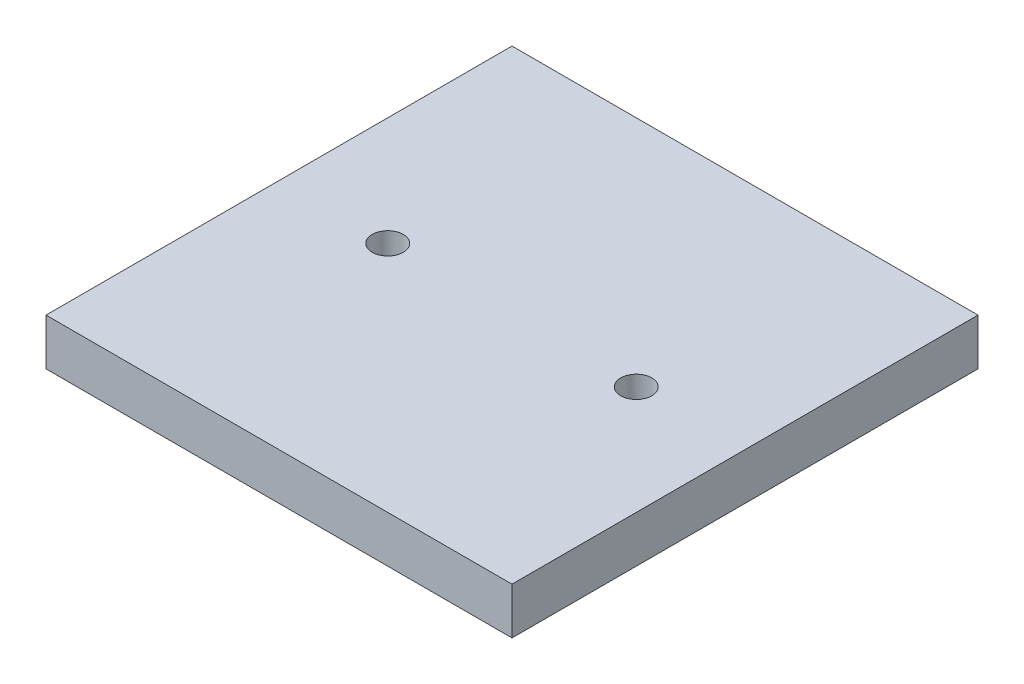
ISO-10303-21;
HEADER;
FILE_DESCRIPTION(('STEP AP214'),'2;1');
FILE_NAME('part.step','',(''),(''),'','','');
FILE_SCHEMA(('AUTOMOTIVE_DESIGN { 1 0 10303 214 1 1 1 1 }'));
ENDSEC;
DATA;
#1=APPLICATION_CONTEXT('core data for automotive mechanical design processes');
#2=APPLICATION_PROTOCOL_DEFINITION('international standard','automotive_design',2000,#1);
#3=PRODUCT_CONTEXT('',#1,'mechanical');
#4=PRODUCT('Part','Part','',(#3));
#5=PRODUCT_RELATED_PRODUCT_CATEGORY('part','',(#4));
#6=PRODUCT_DEFINITION_FORMATION('','',#4);
#7=PRODUCT_DEFINITION_CONTEXT('part definition',#1,'design');
#8=PRODUCT_DEFINITION('design','',#6,#7);
#9=PRODUCT_DEFINITION_SHAPE('','',#8);
#10=(LENGTH_UNIT() NAMED_UNIT(*) SI_UNIT(.MILLI.,.METRE.));
#11=(NAMED_UNIT(*) PLANE_ANGLE_UNIT() SI_UNIT($,.RADIAN.));
#12=(NAMED_UNIT(*) SI_UNIT($,.STERADIAN.) SOLID_ANGLE_UNIT());
#13=UNCERTAINTY_MEASURE_WITH_UNIT(LENGTH_MEASURE(1.E-05),#10,'distance_accuracy_value','');
#14=(GEOMETRIC_REPRESENTATION_CONTEXT(3) GLOBAL_UNCERTAINTY_ASSIGNED_CONTEXT((#13)) GLOBAL_UNIT_ASSIGNED_CONTEXT((#10,
#11,#12)) REPRESENTATION_CONTEXT('',''));
#15=CARTESIAN_POINT('',(0.,0.,0.));
#16=DIRECTION('',(0.,0.,1.));
#17=DIRECTION('',(1.,0.,0.));
#18=AXIS2_PLACEMENT_3D('',#15,#16,#17);
#19=CARTESIAN_POINT('',(15.,3.,-15.));
#20=DIRECTION('',(-1.,0.,0.));
#21=DIRECTION('',(0.,0.,1.));
#22=AXIS2_PLACEMENT_3D('',#19,#20,#21);
#23=PLANE('',#22);
#24=DIRECTION('',(0.,0.,-1.));
#25=VECTOR('',#24,1.);
#26=CARTESIAN_POINT('',(15.,0.,-15.));
#27=LINE('',#26,#25);
#28=CARTESIAN_POINT('',(15.,0.,15.));
#29=VERTEX_POINT('',#28);
#30=CARTESIAN_POINT('',(15.,0.,-15.));
#31=VERTEX_POINT('',#30);
#32=EDGE_CURVE('E100',#29,#31,#27,.T.);
#33=ORIENTED_EDGE('',*,*,#32,.T.);
#34=DIRECTION('',(0.,-1.,0.));
#35=VECTOR('',#34,1.);
#36=CARTESIAN_POINT('',(15.,3.,-15.));
#37=LINE('',#36,#35);
#38=CARTESIAN_POINT('',(15.,3.,-15.));
#39=VERTEX_POINT('',#38);
#40=EDGE_CURVE('E11',#39,#31,#37,.T.);
#41=ORIENTED_EDGE('',*,*,#40,.F.);
#42=DIRECTION('',(0.,0.,-1.));
#43=VECTOR('',#42,1.);
#44=CARTESIAN_POINT('',(15.,3.,-15.));
#45=LINE('',#44,#43);
#46=CARTESIAN_POINT('',(15.,3.,15.));
#47=VERTEX_POINT('',#46);
#48=EDGE_CURVE('E88',#47,#39,#45,.T.);
#49=ORIENTED_EDGE('',*,*,#48,.F.);
#50=DIRECTION('',(0.,-1.,0.));
#51=VECTOR('',#50,1.);
#52=CARTESIAN_POINT('',(15.,3.,15.));
#53=LINE('',#52,#51);
#54=EDGE_CURVE('E96',#47,#29,#53,.T.);
#55=ORIENTED_EDGE('',*,*,#54,.T.);
#56=EDGE_LOOP('',(#33,#41,#49,#55));
#57=FACE_BOUND('',#56,.T.);
#58=ADVANCED_FACE('F37',(#57),#23,.F.);
#59=CARTESIAN_POINT('',(-15.,3.,-15.));
#60=DIRECTION('',(0.,0.,1.));
#61=DIRECTION('',(1.,0.,0.));
#62=AXIS2_PLACEMENT_3D('',#59,#60,#61);
#63=PLANE('',#62);
#64=DIRECTION('',(-1.,0.,0.));
#65=VECTOR('',#64,1.);
#66=CARTESIAN_POINT('',(-15.,0.,-15.));
#67=LINE('',#66,#65);
#68=CARTESIAN_POINT('',(-15.,0.,-15.));
#69=VERTEX_POINT('',#68);
#70=EDGE_CURVE('E92',#31,#69,#67,.T.);
#71=ORIENTED_EDGE('',*,*,#70,.T.);
#72=DIRECTION('',(0.,-1.,0.));
#73=VECTOR('',#72,1.);
#74=CARTESIAN_POINT('',(-15.,3.,-15.));
#75=LINE('',#74,#73);
#76=CARTESIAN_POINT('',(-15.,3.,-15.));
#77=VERTEX_POINT('',#76);
#78=EDGE_CURVE('E45',#77,#69,#75,.T.);
#79=ORIENTED_EDGE('',*,*,#78,.F.);
#80=DIRECTION('',(-1.,0.,0.));
#81=VECTOR('',#80,1.);
#82=CARTESIAN_POINT('',(-15.,3.,-15.));
#83=LINE('',#82,#81);
#84=EDGE_CURVE('E83',#39,#77,#83,.T.);
#85=ORIENTED_EDGE('',*,*,#84,.F.);
#86=ORIENTED_EDGE('',*,*,#40,.T.);
#87=EDGE_LOOP('',(#71,#79,#85,#86));
#88=FACE_BOUND('',#87,.T.);
#89=ADVANCED_FACE('F91',(#88),#63,.F.);
#90=CARTESIAN_POINT('',(-15.,3.,-15.));
#91=DIRECTION('',(1.,0.,0.));
#92=DIRECTION('',(0.,0.,-1.));
#93=AXIS2_PLACEMENT_3D('',#90,#91,#92);
#94=PLANE('',#93);
#95=DIRECTION('',(0.,0.,1.));
#96=VECTOR('',#95,1.);
#97=CARTESIAN_POINT('',(-15.,0.,-15.));
#98=LINE('',#97,#96);
#99=CARTESIAN_POINT('',(-15.,0.,15.));
#100=VERTEX_POINT('',#99);
#101=EDGE_CURVE('E70',#69,#100,#98,.T.);
#102=ORIENTED_EDGE('',*,*,#101,.T.);
#103=DIRECTION('',(0.,-1.,0.));
#104=VECTOR('',#103,1.);
#105=CARTESIAN_POINT('',(-15.,3.,15.));
#106=LINE('',#105,#104);
#107=CARTESIAN_POINT('',(-15.,3.,15.));
#108=VERTEX_POINT('',#107);
#109=EDGE_CURVE('E93',#108,#100,#106,.T.);
#110=ORIENTED_EDGE('',*,*,#109,.F.);
#111=DIRECTION('',(0.,0.,1.));
#112=VECTOR('',#111,1.);
#113=CARTESIAN_POINT('',(-15.,3.,-15.));
#114=LINE('',#113,#112);
#115=EDGE_CURVE('E86',#77,#108,#114,.T.);
#116=ORIENTED_EDGE('',*,*,#115,.F.);
#117=ORIENTED_EDGE('',*,*,#78,.T.);
#118=EDGE_LOOP('',(#102,#110,#116,#117));
#119=FACE_BOUND('',#118,.T.);
#120=ADVANCED_FACE('F94',(#119),#94,.F.);
#121=CARTESIAN_POINT('',(-15.,3.,15.));
#122=DIRECTION('',(0.,0.,-1.));
#123=DIRECTION('',(-1.,0.,0.));
#124=AXIS2_PLACEMENT_3D('',#121,#122,#123);
#125=PLANE('',#124);
#126=DIRECTION('',(1.,0.,0.));
#127=VECTOR('',#126,1.);
#128=CARTESIAN_POINT('',(-15.,0.,15.));
#129=LINE('',#128,#127);
#130=EDGE_CURVE('E76',#100,#29,#129,.T.);
#131=ORIENTED_EDGE('',*,*,#130,.T.);
#132=ORIENTED_EDGE('',*,*,#54,.F.);
#133=DIRECTION('',(1.,0.,0.));
#134=VECTOR('',#133,1.);
#135=CARTESIAN_POINT('',(-15.,3.,15.));
#136=LINE('',#135,#134);
#137=EDGE_CURVE('E53',#108,#47,#136,.T.);
#138=ORIENTED_EDGE('',*,*,#137,.F.);
#139=ORIENTED_EDGE('',*,*,#109,.T.);
#140=EDGE_LOOP('',(#131,#132,#138,#139));
#141=FACE_BOUND('',#140,.T.);
#142=ADVANCED_FACE('F108',(#141),#125,.F.);
#143=CARTESIAN_POINT('',(0.,3.,0.));
#144=DIRECTION('',(0.,1.,0.));
#145=DIRECTION('',(0.,0.,1.));
#146=AXIS2_PLACEMENT_3D('',#143,#144,#145);
#147=PLANE('',#146);
#148=CARTESIAN_POINT('',(-7.99999999999999,3.,0.));
#149=DIRECTION('',(0.,1.,0.));
#150=DIRECTION('',(0.,0.,1.));
#151=AXIS2_PLACEMENT_3D('',#148,#149,#150);
#152=CIRCLE('',#151,0.999999999999998);
#153=CARTESIAN_POINT('',(-7.99999999999999,3.,0.999999999999998));
#154=VERTEX_POINT('',#153);
#155=EDGE_CURVE('E120',#154,#154,#152,.T.);
#156=ORIENTED_EDGE('',*,*,#155,.F.);
#157=EDGE_LOOP('',(#156));
#158=FACE_BOUND('',#157,.T.);
#159=CARTESIAN_POINT('',(7.99999999999999,3.,0.));
#160=DIRECTION('',(0.,1.,0.));
#161=DIRECTION('',(0.,0.,1.));
#162=AXIS2_PLACEMENT_3D('',#159,#160,#161);
#163=CIRCLE('',#162,0.999999999999998);
#164=CARTESIAN_POINT('',(7.99999999999999,3.,0.999999999999995));
#165=VERTEX_POINT('',#164);
#166=EDGE_CURVE('E117',#165,#165,#163,.T.);
#167=ORIENTED_EDGE('',*,*,#166,.F.);
#168=EDGE_LOOP('',(#167));
#169=FACE_BOUND('',#168,.T.);
#170=ORIENTED_EDGE('',*,*,#48,.T.);
#171=ORIENTED_EDGE('',*,*,#84,.T.);
#172=ORIENTED_EDGE('',*,*,#115,.T.);
#173=ORIENTED_EDGE('',*,*,#137,.T.);
#174=EDGE_LOOP('',(#170,#171,#172,#173));
#175=FACE_BOUND('',#174,.T.);
#176=ADVANCED_FACE('F84',(#158,#169,#175),#147,.T.);
#177=CARTESIAN_POINT('',(0.,0.,0.));
#178=DIRECTION('',(0.,1.,0.));
#179=DIRECTION('',(0.,0.,1.));
#180=AXIS2_PLACEMENT_3D('',#177,#178,#179);
#181=PLANE('',#180);
#182=CARTESIAN_POINT('',(-7.99999999999999,0.,0.));
#183=DIRECTION('',(0.,1.,0.));
#184=DIRECTION('',(0.,0.,1.));
#185=AXIS2_PLACEMENT_3D('',#182,#183,#184);
#186=CIRCLE('',#185,0.999999999999998);
#187=CARTESIAN_POINT('',(-7.99999999999999,0.,0.999999999999998));
#188=VERTEX_POINT('',#187);
#189=EDGE_CURVE('E103',#188,#188,#186,.T.);
#190=ORIENTED_EDGE('',*,*,#189,.T.);
#191=EDGE_LOOP('',(#190));
#192=FACE_BOUND('',#191,.T.);
#193=CARTESIAN_POINT('',(7.99999999999999,0.,0.));
#194=DIRECTION('',(0.,1.,0.));
#195=DIRECTION('',(0.,0.,1.));
#196=AXIS2_PLACEMENT_3D('',#193,#194,#195);
#197=CIRCLE('',#196,0.999999999999998);
#198=CARTESIAN_POINT('',(7.99999999999999,0.,0.999999999999995));
#199=VERTEX_POINT('',#198);
#200=EDGE_CURVE('E114',#199,#199,#197,.T.);
#201=ORIENTED_EDGE('',*,*,#200,.T.);
#202=EDGE_LOOP('',(#201));
#203=FACE_BOUND('',#202,.T.);
#204=ORIENTED_EDGE('',*,*,#32,.F.);
#205=ORIENTED_EDGE('',*,*,#130,.F.);
#206=ORIENTED_EDGE('',*,*,#101,.F.);
#207=ORIENTED_EDGE('',*,*,#70,.F.);
#208=EDGE_LOOP('',(#204,#205,#206,#207));
#209=FACE_BOUND('',#208,.T.);
#210=ADVANCED_FACE('F111',(#192,#203,#209),#181,.F.);
#211=CARTESIAN_POINT('',(7.99999999999999,0.,0.));
#212=DIRECTION('',(0.,1.,0.));
#213=DIRECTION('',(0.,0.,1.));
#214=AXIS2_PLACEMENT_3D('',#211,#212,#213);
#215=CYLINDRICAL_SURFACE('',#214,0.999999999999998);
#216=ORIENTED_EDGE('',*,*,#200,.F.);
#217=EDGE_LOOP('',(#216));
#218=FACE_BOUND('',#217,.T.);
#219=ORIENTED_EDGE('',*,*,#166,.T.);
#220=EDGE_LOOP('',(#219));
#221=FACE_BOUND('',#220,.T.);
#222=ADVANCED_FACE('F131',(#218,#221),#215,.F.);
#223=CARTESIAN_POINT('',(-7.99999999999999,0.,0.));
#224=DIRECTION('',(0.,1.,0.));
#225=DIRECTION('',(0.,0.,1.));
#226=AXIS2_PLACEMENT_3D('',#223,#224,#225);
#227=CYLINDRICAL_SURFACE('',#226,0.999999999999998);
#228=ORIENTED_EDGE('',*,*,#189,.F.);
#229=EDGE_LOOP('',(#228));
#230=FACE_BOUND('',#229,.T.);
#231=ORIENTED_EDGE('',*,*,#155,.T.);
#232=EDGE_LOOP('',(#231));
#233=FACE_BOUND('',#232,.T.);
#234=ADVANCED_FACE('F128',(#230,#233),#227,.F.);
#235=CLOSED_SHELL('',(#58,#89,#120,#142,#176,#210,#222,#234));
#236=MANIFOLD_SOLID_BREP('B2',#235);
#237=ADVANCED_BREP_SHAPE_REPRESENTATION('',(#18,#236),#14);
#238=SHAPE_DEFINITION_REPRESENTATION(#9,#237);
ENDSEC;
END-ISO-10303-21;
